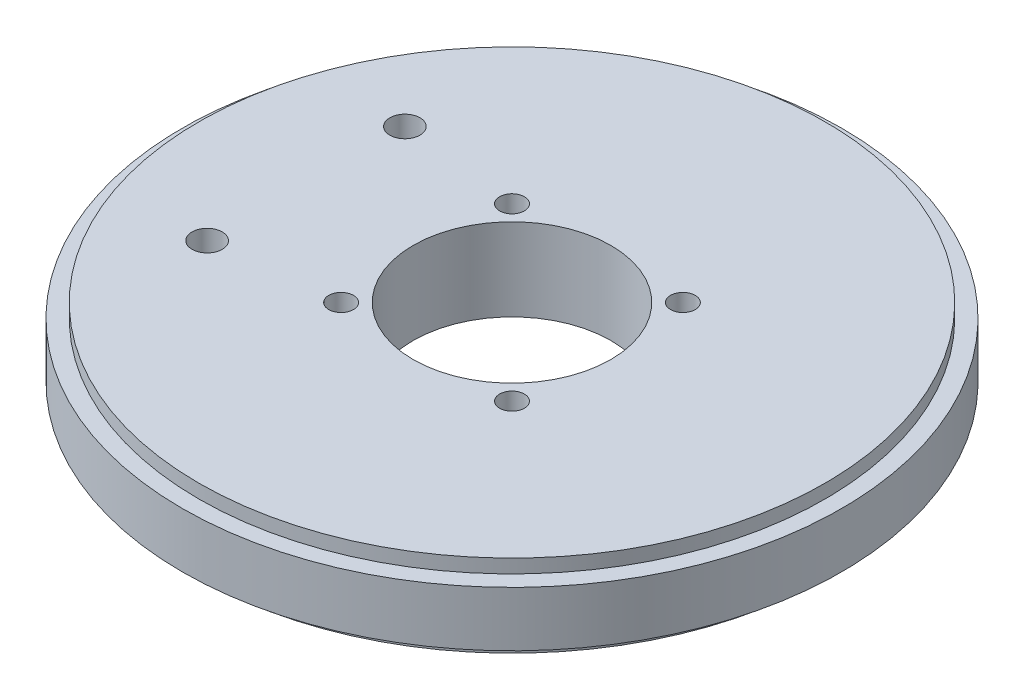
ISO-10303-21;
HEADER;
FILE_DESCRIPTION(('STEP AP214'),'2;1');
FILE_NAME('part.step','',(''),(''),'','','');
FILE_SCHEMA(('AUTOMOTIVE_DESIGN { 1 0 10303 214 1 1 1 1 }'));
ENDSEC;
DATA;
#1=APPLICATION_CONTEXT('core data for automotive mechanical design processes');
#2=APPLICATION_PROTOCOL_DEFINITION('international standard','automotive_design',2000,#1);
#3=PRODUCT_CONTEXT('',#1,'mechanical');
#4=PRODUCT('Part','Part','',(#3));
#5=PRODUCT_RELATED_PRODUCT_CATEGORY('part','',(#4));
#6=PRODUCT_DEFINITION_FORMATION('','',#4);
#7=PRODUCT_DEFINITION_CONTEXT('part definition',#1,'design');
#8=PRODUCT_DEFINITION('design','',#6,#7);
#9=PRODUCT_DEFINITION_SHAPE('','',#8);
#10=(LENGTH_UNIT() NAMED_UNIT(*) SI_UNIT(.MILLI.,.METRE.));
#11=(NAMED_UNIT(*) PLANE_ANGLE_UNIT() SI_UNIT($,.RADIAN.));
#12=(NAMED_UNIT(*) SI_UNIT($,.STERADIAN.) SOLID_ANGLE_UNIT());
#13=UNCERTAINTY_MEASURE_WITH_UNIT(LENGTH_MEASURE(1.E-05),#10,'distance_accuracy_value','');
#14=(GEOMETRIC_REPRESENTATION_CONTEXT(3) GLOBAL_UNCERTAINTY_ASSIGNED_CONTEXT((#13)) GLOBAL_UNIT_ASSIGNED_CONTEXT((#10,
#11,#12)) REPRESENTATION_CONTEXT('',''));
#15=CARTESIAN_POINT('',(0.,0.,0.));
#16=DIRECTION('',(0.,0.,1.));
#17=DIRECTION('',(1.,0.,0.));
#18=AXIS2_PLACEMENT_3D('',#15,#16,#17);
#19=CARTESIAN_POINT('',(0.,7.5,0.));
#20=DIRECTION('',(0.,-1.,0.));
#21=DIRECTION('',(0.,0.,-1.));
#22=AXIS2_PLACEMENT_3D('',#19,#20,#21);
#23=CYLINDRICAL_SURFACE('',#22,57.);
#24=CARTESIAN_POINT('',(0.,5.,0.));
#25=DIRECTION('',(0.,1.,0.));
#26=DIRECTION('',(0.,0.,1.));
#27=AXIS2_PLACEMENT_3D('',#24,#25,#26);
#28=CIRCLE('',#27,57.);
#29=CARTESIAN_POINT('',(0.,5.,57.));
#30=VERTEX_POINT('',#29);
#31=EDGE_CURVE('E52',#30,#30,#28,.T.);
#32=ORIENTED_EDGE('',*,*,#31,.T.);
#33=EDGE_LOOP('',(#32));
#34=FACE_BOUND('',#33,.T.);
#35=CARTESIAN_POINT('',(0.,7.5,0.));
#36=DIRECTION('',(0.,1.,0.));
#37=DIRECTION('',(0.,0.,1.));
#38=AXIS2_PLACEMENT_3D('',#35,#36,#37);
#39=CIRCLE('',#38,57.);
#40=CARTESIAN_POINT('',(0.,7.5,57.));
#41=VERTEX_POINT('',#40);
#42=EDGE_CURVE('E38',#41,#41,#39,.T.);
#43=ORIENTED_EDGE('',*,*,#42,.F.);
#44=EDGE_LOOP('',(#43));
#45=FACE_BOUND('',#44,.T.);
#46=ADVANCED_FACE('F32',(#34,#45),#23,.T.);
#47=CARTESIAN_POINT('',(0.,7.5,0.));
#48=DIRECTION('',(0.,1.,0.));
#49=DIRECTION('',(0.,0.,1.));
#50=AXIS2_PLACEMENT_3D('',#47,#48,#49);
#51=PLANE('',#50);
#52=CARTESIAN_POINT('',(-37.5000000000002,7.5,-18.));
#53=DIRECTION('',(0.,1.,0.));
#54=DIRECTION('',(0.,0.,1.));
#55=AXIS2_PLACEMENT_3D('',#52,#53,#54);
#56=CIRCLE('',#55,2.74999999999999);
#57=CARTESIAN_POINT('',(-37.5000000000002,7.5,-15.25));
#58=VERTEX_POINT('',#57);
#59=EDGE_CURVE('E96',#58,#58,#56,.T.);
#60=ORIENTED_EDGE('',*,*,#59,.F.);
#61=EDGE_LOOP('',(#60));
#62=FACE_BOUND('',#61,.T.);
#63=CARTESIAN_POINT('',(-37.4999999999998,7.5,18.));
#64=DIRECTION('',(0.,1.,0.));
#65=DIRECTION('',(0.,0.,1.));
#66=AXIS2_PLACEMENT_3D('',#63,#64,#65);
#67=CIRCLE('',#66,2.74999999999999);
#68=CARTESIAN_POINT('',(-37.4999999999998,7.5,20.75));
#69=VERTEX_POINT('',#68);
#70=EDGE_CURVE('E90',#69,#69,#67,.T.);
#71=ORIENTED_EDGE('',*,*,#70,.F.);
#72=EDGE_LOOP('',(#71));
#73=FACE_BOUND('',#72,.T.);
#74=CARTESIAN_POINT('',(15.5563491861039,7.5,-15.5563491861042));
#75=DIRECTION('',(0.,-1.,0.));
#76=DIRECTION('',(0.,0.,-1.));
#77=AXIS2_PLACEMENT_3D('',#74,#75,#76);
#78=CIRCLE('',#77,2.25);
#79=CARTESIAN_POINT('',(15.5563491861039,7.5,-17.8063491861042));
#80=VERTEX_POINT('',#79);
#81=EDGE_CURVE('E81',#80,#80,#78,.T.);
#82=ORIENTED_EDGE('',*,*,#81,.T.);
#83=EDGE_LOOP('',(#82));
#84=FACE_BOUND('',#83,.T.);
#85=CARTESIAN_POINT('',(15.556349186104,7.5,15.556349186104));
#86=DIRECTION('',(0.,-1.,0.));
#87=DIRECTION('',(0.,0.,-1.));
#88=AXIS2_PLACEMENT_3D('',#85,#86,#87);
#89=CIRCLE('',#88,2.25);
#90=CARTESIAN_POINT('',(15.556349186104,7.5,13.306349186104));
#91=VERTEX_POINT('',#90);
#92=EDGE_CURVE('E75',#91,#91,#89,.T.);
#93=ORIENTED_EDGE('',*,*,#92,.T.);
#94=EDGE_LOOP('',(#93));
#95=FACE_BOUND('',#94,.T.);
#96=CARTESIAN_POINT('',(-15.556349186104,7.5,15.5563491861041));
#97=DIRECTION('',(0.,-1.,0.));
#98=DIRECTION('',(0.,0.,-1.));
#99=AXIS2_PLACEMENT_3D('',#96,#97,#98);
#100=CIRCLE('',#99,2.25);
#101=CARTESIAN_POINT('',(-15.556349186104,7.5,13.3063491861041));
#102=VERTEX_POINT('',#101);
#103=EDGE_CURVE('E69',#102,#102,#100,.T.);
#104=ORIENTED_EDGE('',*,*,#103,.T.);
#105=EDGE_LOOP('',(#104));
#106=FACE_BOUND('',#105,.T.);
#107=CARTESIAN_POINT('',(-15.556349186104,7.5,-15.556349186104));
#108=DIRECTION('',(0.,-1.,0.));
#109=DIRECTION('',(0.,0.,-1.));
#110=AXIS2_PLACEMENT_3D('',#107,#108,#109);
#111=CIRCLE('',#110,2.25);
#112=CARTESIAN_POINT('',(-15.556349186104,7.5,-17.806349186104));
#113=VERTEX_POINT('',#112);
#114=EDGE_CURVE('E63',#113,#113,#111,.T.);
#115=ORIENTED_EDGE('',*,*,#114,.T.);
#116=EDGE_LOOP('',(#115));
#117=FACE_BOUND('',#116,.T.);
#118=CARTESIAN_POINT('',(0.,7.5,0.));
#119=DIRECTION('',(0.,1.,0.));
#120=DIRECTION('',(0.,0.,1.));
#121=AXIS2_PLACEMENT_3D('',#118,#119,#120);
#122=CIRCLE('',#121,18.);
#123=CARTESIAN_POINT('',(0.,7.5,18.));
#124=VERTEX_POINT('',#123);
#125=EDGE_CURVE('E60',#124,#124,#122,.T.);
#126=ORIENTED_EDGE('',*,*,#125,.F.);
#127=EDGE_LOOP('',(#126));
#128=FACE_BOUND('',#127,.T.);
#129=ORIENTED_EDGE('',*,*,#42,.T.);
#130=EDGE_LOOP('',(#129));
#131=FACE_BOUND('',#130,.T.);
#132=ADVANCED_FACE('F102',(#62,#73,#84,#95,#106,#117,#128,#131),#51,.T.);
#133=CARTESIAN_POINT('',(0.,5.,0.));
#134=DIRECTION('',(0.,1.,0.));
#135=DIRECTION('',(0.,0.,1.));
#136=AXIS2_PLACEMENT_3D('',#133,#134,#135);
#137=PLANE('',#136);
#138=CARTESIAN_POINT('',(0.,5.,0.));
#139=DIRECTION('',(0.,1.,0.));
#140=DIRECTION('',(0.,0.,1.));
#141=AXIS2_PLACEMENT_3D('',#138,#139,#140);
#142=CIRCLE('',#141,60.);
#143=CARTESIAN_POINT('',(0.,5.,60.));
#144=VERTEX_POINT('',#143);
#145=EDGE_CURVE('E47',#144,#144,#142,.T.);
#146=ORIENTED_EDGE('',*,*,#145,.T.);
#147=EDGE_LOOP('',(#146));
#148=FACE_BOUND('',#147,.T.);
#149=ORIENTED_EDGE('',*,*,#31,.F.);
#150=EDGE_LOOP('',(#149));
#151=FACE_BOUND('',#150,.T.);
#152=ADVANCED_FACE('F105',(#148,#151),#137,.T.);
#153=CARTESIAN_POINT('',(0.,-5.,0.));
#154=DIRECTION('',(0.,1.,0.));
#155=DIRECTION('',(0.,0.,1.));
#156=AXIS2_PLACEMENT_3D('',#153,#154,#155);
#157=PLANE('',#156);
#158=CARTESIAN_POINT('',(0.,-5.,0.));
#159=DIRECTION('',(0.,1.,0.));
#160=DIRECTION('',(0.,0.,1.));
#161=AXIS2_PLACEMENT_3D('',#158,#159,#160);
#162=CIRCLE('',#161,60.);
#163=CARTESIAN_POINT('',(0.,-5.,60.));
#164=VERTEX_POINT('',#163);
#165=EDGE_CURVE('E49',#164,#164,#162,.T.);
#166=ORIENTED_EDGE('',*,*,#165,.F.);
#167=EDGE_LOOP('',(#166));
#168=FACE_BOUND('',#167,.T.);
#169=CARTESIAN_POINT('',(0.,-5.,0.));
#170=DIRECTION('',(0.,1.,0.));
#171=DIRECTION('',(0.,0.,1.));
#172=AXIS2_PLACEMENT_3D('',#169,#170,#171);
#173=CIRCLE('',#172,57.);
#174=CARTESIAN_POINT('',(0.,-5.,57.));
#175=VERTEX_POINT('',#174);
#176=EDGE_CURVE('E10',#175,#175,#173,.T.);
#177=ORIENTED_EDGE('',*,*,#176,.T.);
#178=EDGE_LOOP('',(#177));
#179=FACE_BOUND('',#178,.T.);
#180=ADVANCED_FACE('F144',(#168,#179),#157,.F.);
#181=CARTESIAN_POINT('',(0.,5.,0.));
#182=DIRECTION('',(0.,-1.,0.));
#183=DIRECTION('',(0.,0.,-1.));
#184=AXIS2_PLACEMENT_3D('',#181,#182,#183);
#185=CYLINDRICAL_SURFACE('',#184,60.);
#186=ORIENTED_EDGE('',*,*,#145,.F.);
#187=EDGE_LOOP('',(#186));
#188=FACE_BOUND('',#187,.T.);
#189=ORIENTED_EDGE('',*,*,#165,.T.);
#190=EDGE_LOOP('',(#189));
#191=FACE_BOUND('',#190,.T.);
#192=ADVANCED_FACE('F149',(#188,#191),#185,.T.);
#193=CARTESIAN_POINT('',(0.,-7.5,0.));
#194=DIRECTION('',(0.,1.,0.));
#195=DIRECTION('',(0.,0.,1.));
#196=AXIS2_PLACEMENT_3D('',#193,#194,#195);
#197=PLANE('',#196);
#198=CARTESIAN_POINT('',(-37.5000000000002,-7.5,-18.));
#199=DIRECTION('',(0.,1.,0.));
#200=DIRECTION('',(0.,0.,1.));
#201=AXIS2_PLACEMENT_3D('',#198,#199,#200);
#202=CIRCLE('',#201,2.75);
#203=CARTESIAN_POINT('',(-37.5000000000002,-7.5,-15.25));
#204=VERTEX_POINT('',#203);
#205=EDGE_CURVE('E93',#204,#204,#202,.T.);
#206=ORIENTED_EDGE('',*,*,#205,.T.);
#207=EDGE_LOOP('',(#206));
#208=FACE_BOUND('',#207,.T.);
#209=CARTESIAN_POINT('',(-37.4999999999998,-7.5,18.));
#210=DIRECTION('',(0.,1.,0.));
#211=DIRECTION('',(0.,0.,1.));
#212=AXIS2_PLACEMENT_3D('',#209,#210,#211);
#213=CIRCLE('',#212,2.75);
#214=CARTESIAN_POINT('',(-37.4999999999998,-7.5,20.75));
#215=VERTEX_POINT('',#214);
#216=EDGE_CURVE('E87',#215,#215,#213,.T.);
#217=ORIENTED_EDGE('',*,*,#216,.T.);
#218=EDGE_LOOP('',(#217));
#219=FACE_BOUND('',#218,.T.);
#220=CARTESIAN_POINT('',(15.5563491861039,-7.5,-15.5563491861042));
#221=DIRECTION('',(0.,-1.,0.));
#222=DIRECTION('',(0.,0.,-1.));
#223=AXIS2_PLACEMENT_3D('',#220,#221,#222);
#224=CIRCLE('',#223,2.25);
#225=CARTESIAN_POINT('',(15.5563491861039,-7.5,-17.8063491861042));
#226=VERTEX_POINT('',#225);
#227=EDGE_CURVE('E84',#226,#226,#224,.T.);
#228=ORIENTED_EDGE('',*,*,#227,.F.);
#229=EDGE_LOOP('',(#228));
#230=FACE_BOUND('',#229,.T.);
#231=CARTESIAN_POINT('',(15.556349186104,-7.5,15.556349186104));
#232=DIRECTION('',(0.,-1.,0.));
#233=DIRECTION('',(0.,0.,-1.));
#234=AXIS2_PLACEMENT_3D('',#231,#232,#233);
#235=CIRCLE('',#234,2.25);
#236=CARTESIAN_POINT('',(15.556349186104,-7.5,13.306349186104));
#237=VERTEX_POINT('',#236);
#238=EDGE_CURVE('E78',#237,#237,#235,.T.);
#239=ORIENTED_EDGE('',*,*,#238,.F.);
#240=EDGE_LOOP('',(#239));
#241=FACE_BOUND('',#240,.T.);
#242=CARTESIAN_POINT('',(-15.556349186104,-7.5,15.5563491861041));
#243=DIRECTION('',(0.,-1.,0.));
#244=DIRECTION('',(0.,0.,-1.));
#245=AXIS2_PLACEMENT_3D('',#242,#243,#244);
#246=CIRCLE('',#245,2.25);
#247=CARTESIAN_POINT('',(-15.556349186104,-7.5,13.3063491861041));
#248=VERTEX_POINT('',#247);
#249=EDGE_CURVE('E72',#248,#248,#246,.T.);
#250=ORIENTED_EDGE('',*,*,#249,.F.);
#251=EDGE_LOOP('',(#250));
#252=FACE_BOUND('',#251,.T.);
#253=CARTESIAN_POINT('',(-15.556349186104,-7.5,-15.556349186104));
#254=DIRECTION('',(0.,-1.,0.));
#255=DIRECTION('',(0.,0.,-1.));
#256=AXIS2_PLACEMENT_3D('',#253,#254,#255);
#257=CIRCLE('',#256,2.25);
#258=CARTESIAN_POINT('',(-15.556349186104,-7.5,-17.806349186104));
#259=VERTEX_POINT('',#258);
#260=EDGE_CURVE('E66',#259,#259,#257,.T.);
#261=ORIENTED_EDGE('',*,*,#260,.F.);
#262=EDGE_LOOP('',(#261));
#263=FACE_BOUND('',#262,.T.);
#264=CARTESIAN_POINT('',(0.,-7.5,0.));
#265=DIRECTION('',(0.,1.,0.));
#266=DIRECTION('',(0.,0.,1.));
#267=AXIS2_PLACEMENT_3D('',#264,#265,#266);
#268=CIRCLE('',#267,18.);
#269=CARTESIAN_POINT('',(0.,-7.5,18.));
#270=VERTEX_POINT('',#269);
#271=EDGE_CURVE('E57',#270,#270,#268,.T.);
#272=ORIENTED_EDGE('',*,*,#271,.T.);
#273=EDGE_LOOP('',(#272));
#274=FACE_BOUND('',#273,.T.);
#275=CARTESIAN_POINT('',(0.,-7.5,0.));
#276=DIRECTION('',(0.,1.,0.));
#277=DIRECTION('',(0.,0.,1.));
#278=AXIS2_PLACEMENT_3D('',#275,#276,#277);
#279=CIRCLE('',#278,57.);
#280=CARTESIAN_POINT('',(0.,-7.5,57.));
#281=VERTEX_POINT('',#280);
#282=EDGE_CURVE('E42',#281,#281,#279,.T.);
#283=ORIENTED_EDGE('',*,*,#282,.F.);
#284=EDGE_LOOP('',(#283));
#285=FACE_BOUND('',#284,.T.);
#286=ADVANCED_FACE('F132',(#208,#219,#230,#241,#252,#263,#274,#285),#197,.F.);
#287=ORIENTED_EDGE('',*,*,#282,.T.);
#288=EDGE_LOOP('',(#287));
#289=FACE_BOUND('',#288,.T.);
#290=ORIENTED_EDGE('',*,*,#176,.F.);
#291=EDGE_LOOP('',(#290));
#292=FACE_BOUND('',#291,.T.);
#293=ADVANCED_FACE('F122',(#289,#292),#23,.T.);
#294=CARTESIAN_POINT('',(0.,-7.5,0.));
#295=DIRECTION('',(0.,1.,0.));
#296=DIRECTION('',(0.,0.,1.));
#297=AXIS2_PLACEMENT_3D('',#294,#295,#296);
#298=CYLINDRICAL_SURFACE('',#297,18.);
#299=ORIENTED_EDGE('',*,*,#271,.F.);
#300=EDGE_LOOP('',(#299));
#301=FACE_BOUND('',#300,.T.);
#302=ORIENTED_EDGE('',*,*,#125,.T.);
#303=EDGE_LOOP('',(#302));
#304=FACE_BOUND('',#303,.T.);
#305=ADVANCED_FACE('F119',(#301,#304),#298,.F.);
#306=CARTESIAN_POINT('',(-15.556349186104,-7.5,-15.556349186104));
#307=DIRECTION('',(0.,-1.,0.));
#308=DIRECTION('',(0.,0.,-1.));
#309=AXIS2_PLACEMENT_3D('',#306,#307,#308);
#310=CYLINDRICAL_SURFACE('',#309,2.25);
#311=ORIENTED_EDGE('',*,*,#114,.F.);
#312=EDGE_LOOP('',(#311));
#313=FACE_BOUND('',#312,.T.);
#314=ORIENTED_EDGE('',*,*,#260,.T.);
#315=EDGE_LOOP('',(#314));
#316=FACE_BOUND('',#315,.T.);
#317=ADVANCED_FACE('F121',(#313,#316),#310,.F.);
#318=CARTESIAN_POINT('',(-15.556349186104,-7.5,15.5563491861041));
#319=DIRECTION('',(0.,-1.,0.));
#320=DIRECTION('',(0.,0.,-1.));
#321=AXIS2_PLACEMENT_3D('',#318,#319,#320);
#322=CYLINDRICAL_SURFACE('',#321,2.25);
#323=ORIENTED_EDGE('',*,*,#103,.F.);
#324=EDGE_LOOP('',(#323));
#325=FACE_BOUND('',#324,.T.);
#326=ORIENTED_EDGE('',*,*,#249,.T.);
#327=EDGE_LOOP('',(#326));
#328=FACE_BOUND('',#327,.T.);
#329=ADVANCED_FACE('F129',(#325,#328),#322,.F.);
#330=CARTESIAN_POINT('',(15.556349186104,-7.5,15.556349186104));
#331=DIRECTION('',(0.,-1.,0.));
#332=DIRECTION('',(0.,0.,-1.));
#333=AXIS2_PLACEMENT_3D('',#330,#331,#332);
#334=CYLINDRICAL_SURFACE('',#333,2.25);
#335=ORIENTED_EDGE('',*,*,#92,.F.);
#336=EDGE_LOOP('',(#335));
#337=FACE_BOUND('',#336,.T.);
#338=ORIENTED_EDGE('',*,*,#238,.T.);
#339=EDGE_LOOP('',(#338));
#340=FACE_BOUND('',#339,.T.);
#341=ADVANCED_FACE('F177',(#337,#340),#334,.F.);
#342=CARTESIAN_POINT('',(15.5563491861039,-7.5,-15.5563491861042));
#343=DIRECTION('',(0.,-1.,0.));
#344=DIRECTION('',(0.,0.,-1.));
#345=AXIS2_PLACEMENT_3D('',#342,#343,#344);
#346=CYLINDRICAL_SURFACE('',#345,2.25);
#347=ORIENTED_EDGE('',*,*,#81,.F.);
#348=EDGE_LOOP('',(#347));
#349=FACE_BOUND('',#348,.T.);
#350=ORIENTED_EDGE('',*,*,#227,.T.);
#351=EDGE_LOOP('',(#350));
#352=FACE_BOUND('',#351,.T.);
#353=ADVANCED_FACE('F183',(#349,#352),#346,.F.);
#354=CARTESIAN_POINT('',(-37.4999999999998,7.5,18.));
#355=DIRECTION('',(0.,1.,0.));
#356=DIRECTION('',(0.,0.,1.));
#357=AXIS2_PLACEMENT_3D('',#354,#355,#356);
#358=CYLINDRICAL_SURFACE('',#357,2.74999999999999);
#359=ORIENTED_EDGE('',*,*,#216,.F.);
#360=EDGE_LOOP('',(#359));
#361=FACE_BOUND('',#360,.T.);
#362=ORIENTED_EDGE('',*,*,#70,.T.);
#363=EDGE_LOOP('',(#362));
#364=FACE_BOUND('',#363,.T.);
#365=ADVANCED_FACE('F189',(#361,#364),#358,.F.);
#366=CARTESIAN_POINT('',(-37.5000000000002,7.5,-18.));
#367=DIRECTION('',(0.,1.,0.));
#368=DIRECTION('',(0.,0.,1.));
#369=AXIS2_PLACEMENT_3D('',#366,#367,#368);
#370=CYLINDRICAL_SURFACE('',#369,2.74999999999999);
#371=ORIENTED_EDGE('',*,*,#205,.F.);
#372=EDGE_LOOP('',(#371));
#373=FACE_BOUND('',#372,.T.);
#374=ORIENTED_EDGE('',*,*,#59,.T.);
#375=EDGE_LOOP('',(#374));
#376=FACE_BOUND('',#375,.T.);
#377=ADVANCED_FACE('F100',(#373,#376),#370,.F.);
#378=CLOSED_SHELL('',(#46,#132,#152,#180,#192,#286,#293,#305,#317,#329,#341,#353,#365,#377));
#379=MANIFOLD_SOLID_BREP('B2',#378);
#380=ADVANCED_BREP_SHAPE_REPRESENTATION('',(#18,#379),#14);
#381=SHAPE_DEFINITION_REPRESENTATION(#9,#380);
ENDSEC;
END-ISO-10303-21;
